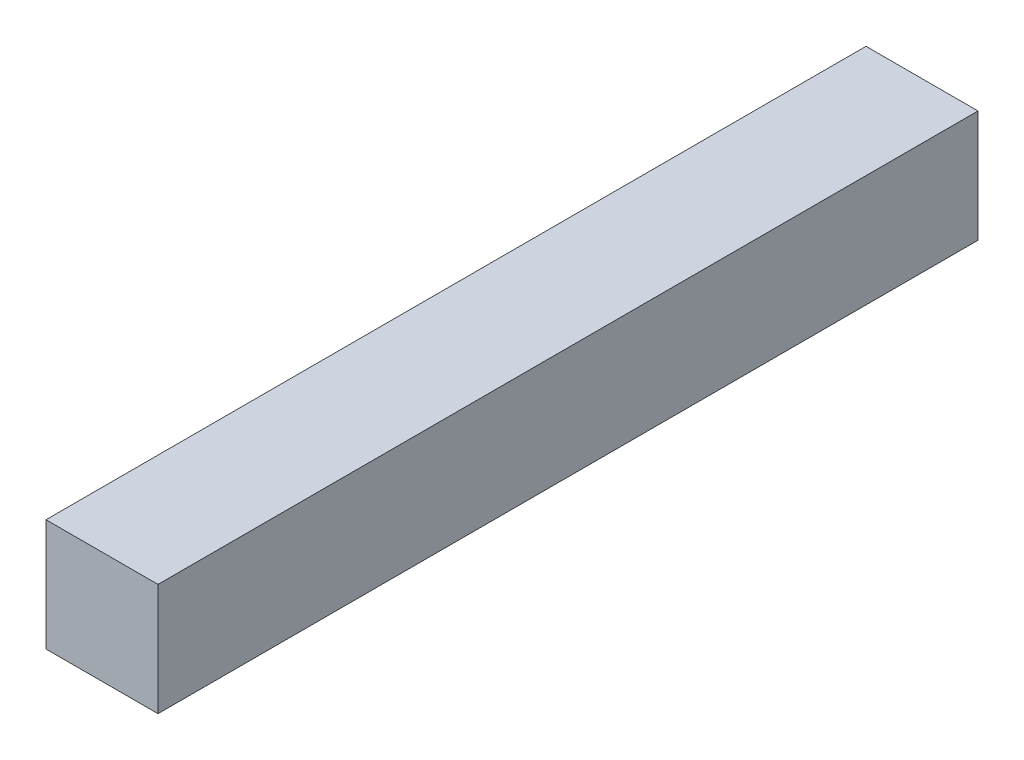
ISO-10303-21;
HEADER;
FILE_DESCRIPTION(('STEP AP214'),'2;1');
FILE_NAME('part.step','',(''),(''),'','','');
FILE_SCHEMA(('AUTOMOTIVE_DESIGN { 1 0 10303 214 1 1 1 1 }'));
ENDSEC;
DATA;
#1=APPLICATION_CONTEXT('core data for automotive mechanical design processes');
#2=APPLICATION_PROTOCOL_DEFINITION('international standard','automotive_design',2000,#1);
#3=PRODUCT_CONTEXT('',#1,'mechanical');
#4=PRODUCT('Part','Part','',(#3));
#5=PRODUCT_RELATED_PRODUCT_CATEGORY('part','',(#4));
#6=PRODUCT_DEFINITION_FORMATION('','',#4);
#7=PRODUCT_DEFINITION_CONTEXT('part definition',#1,'design');
#8=PRODUCT_DEFINITION('design','',#6,#7);
#9=PRODUCT_DEFINITION_SHAPE('','',#8);
#10=(LENGTH_UNIT() NAMED_UNIT(*) SI_UNIT(.MILLI.,.METRE.));
#11=(NAMED_UNIT(*) PLANE_ANGLE_UNIT() SI_UNIT($,.RADIAN.));
#12=(NAMED_UNIT(*) SI_UNIT($,.STERADIAN.) SOLID_ANGLE_UNIT());
#13=UNCERTAINTY_MEASURE_WITH_UNIT(LENGTH_MEASURE(1.E-05),#10,'distance_accuracy_value','');
#14=(GEOMETRIC_REPRESENTATION_CONTEXT(3) GLOBAL_UNCERTAINTY_ASSIGNED_CONTEXT((#13)) GLOBAL_UNIT_ASSIGNED_CONTEXT((#10,
#11,#12)) REPRESENTATION_CONTEXT('',''));
#15=CARTESIAN_POINT('',(0.,0.,0.));
#16=DIRECTION('',(0.,0.,1.));
#17=DIRECTION('',(1.,0.,0.));
#18=AXIS2_PLACEMENT_3D('',#15,#16,#17);
#19=CARTESIAN_POINT('',(-2.39,2.39,35.));
#20=DIRECTION('',(1.,0.,0.));
#21=DIRECTION('',(0.,1.,0.));
#22=AXIS2_PLACEMENT_3D('',#19,#20,#21);
#23=PLANE('',#22);
#24=DIRECTION('',(0.,-1.,0.));
#25=VECTOR('',#24,1.);
#26=CARTESIAN_POINT('',(-2.39,2.39,0.));
#27=LINE('',#26,#25);
#28=CARTESIAN_POINT('',(-2.39,2.39,0.));
#29=VERTEX_POINT('',#28);
#30=CARTESIAN_POINT('',(-2.39,-2.39,0.));
#31=VERTEX_POINT('',#30);
#32=EDGE_CURVE('E96',#29,#31,#27,.T.);
#33=ORIENTED_EDGE('',*,*,#32,.T.);
#34=DIRECTION('',(0.,0.,-1.));
#35=VECTOR('',#34,1.);
#36=CARTESIAN_POINT('',(-2.39,-2.39,35.));
#37=LINE('',#36,#35);
#38=CARTESIAN_POINT('',(-2.39,-2.39,35.));
#39=VERTEX_POINT('',#38);
#40=EDGE_CURVE('E11',#39,#31,#37,.T.);
#41=ORIENTED_EDGE('',*,*,#40,.F.);
#42=DIRECTION('',(0.,-1.,0.));
#43=VECTOR('',#42,1.);
#44=CARTESIAN_POINT('',(-2.39,2.39,35.));
#45=LINE('',#44,#43);
#46=CARTESIAN_POINT('',(-2.39,2.39,35.));
#47=VERTEX_POINT('',#46);
#48=EDGE_CURVE('E82',#47,#39,#45,.T.);
#49=ORIENTED_EDGE('',*,*,#48,.F.);
#50=DIRECTION('',(0.,0.,-1.));
#51=VECTOR('',#50,1.);
#52=CARTESIAN_POINT('',(-2.39,2.39,35.));
#53=LINE('',#52,#51);
#54=EDGE_CURVE('E49',#47,#29,#53,.T.);
#55=ORIENTED_EDGE('',*,*,#54,.T.);
#56=EDGE_LOOP('',(#33,#41,#49,#55));
#57=FACE_BOUND('',#56,.T.);
#58=ADVANCED_FACE('F33',(#57),#23,.F.);
#59=CARTESIAN_POINT('',(-2.39,-2.39,35.));
#60=DIRECTION('',(0.,1.,0.));
#61=DIRECTION('',(0.,0.,1.));
#62=AXIS2_PLACEMENT_3D('',#59,#60,#61);
#63=PLANE('',#62);
#64=DIRECTION('',(1.,0.,0.));
#65=VECTOR('',#64,1.);
#66=CARTESIAN_POINT('',(-2.39,-2.39,0.));
#67=LINE('',#66,#65);
#68=CARTESIAN_POINT('',(2.39,-2.39,0.));
#69=VERTEX_POINT('',#68);
#70=EDGE_CURVE('E87',#31,#69,#67,.T.);
#71=ORIENTED_EDGE('',*,*,#70,.T.);
#72=DIRECTION('',(0.,0.,-1.));
#73=VECTOR('',#72,1.);
#74=CARTESIAN_POINT('',(2.39,-2.39,35.));
#75=LINE('',#74,#73);
#76=CARTESIAN_POINT('',(2.39,-2.39,35.));
#77=VERTEX_POINT('',#76);
#78=EDGE_CURVE('E41',#77,#69,#75,.T.);
#79=ORIENTED_EDGE('',*,*,#78,.F.);
#80=DIRECTION('',(1.,0.,0.));
#81=VECTOR('',#80,1.);
#82=CARTESIAN_POINT('',(-2.39,-2.39,35.));
#83=LINE('',#82,#81);
#84=EDGE_CURVE('E74',#39,#77,#83,.T.);
#85=ORIENTED_EDGE('',*,*,#84,.F.);
#86=ORIENTED_EDGE('',*,*,#40,.T.);
#87=EDGE_LOOP('',(#71,#79,#85,#86));
#88=FACE_BOUND('',#87,.T.);
#89=ADVANCED_FACE('F86',(#88),#63,.F.);
#90=CARTESIAN_POINT('',(2.39,2.39,35.));
#91=DIRECTION('',(1.,0.,0.));
#92=DIRECTION('',(0.,1.,0.));
#93=AXIS2_PLACEMENT_3D('',#90,#91,#92);
#94=PLANE('',#93);
#95=DIRECTION('',(0.,-1.,0.));
#96=VECTOR('',#95,1.);
#97=CARTESIAN_POINT('',(2.39,2.39,0.));
#98=LINE('',#97,#96);
#99=CARTESIAN_POINT('',(2.39,2.39,0.));
#100=VERTEX_POINT('',#99);
#101=EDGE_CURVE('E99',#100,#69,#98,.T.);
#102=ORIENTED_EDGE('',*,*,#101,.F.);
#103=DIRECTION('',(0.,0.,-1.));
#104=VECTOR('',#103,1.);
#105=CARTESIAN_POINT('',(2.39,2.39,35.));
#106=LINE('',#105,#104);
#107=CARTESIAN_POINT('',(2.39,2.39,35.));
#108=VERTEX_POINT('',#107);
#109=EDGE_CURVE('E63',#108,#100,#106,.T.);
#110=ORIENTED_EDGE('',*,*,#109,.F.);
#111=DIRECTION('',(0.,-1.,0.));
#112=VECTOR('',#111,1.);
#113=CARTESIAN_POINT('',(2.39,2.39,35.));
#114=LINE('',#113,#112);
#115=EDGE_CURVE('E81',#108,#77,#114,.T.);
#116=ORIENTED_EDGE('',*,*,#115,.T.);
#117=ORIENTED_EDGE('',*,*,#78,.T.);
#118=EDGE_LOOP('',(#102,#110,#116,#117));
#119=FACE_BOUND('',#118,.T.);
#120=ADVANCED_FACE('F90',(#119),#94,.T.);
#121=CARTESIAN_POINT('',(-2.39,2.39,35.));
#122=DIRECTION('',(0.,1.,0.));
#123=DIRECTION('',(0.,0.,1.));
#124=AXIS2_PLACEMENT_3D('',#121,#122,#123);
#125=PLANE('',#124);
#126=DIRECTION('',(1.,0.,0.));
#127=VECTOR('',#126,1.);
#128=CARTESIAN_POINT('',(-2.39,2.39,0.));
#129=LINE('',#128,#127);
#130=EDGE_CURVE('E101',#29,#100,#129,.T.);
#131=ORIENTED_EDGE('',*,*,#130,.F.);
#132=ORIENTED_EDGE('',*,*,#54,.F.);
#133=DIRECTION('',(1.,0.,0.));
#134=VECTOR('',#133,1.);
#135=CARTESIAN_POINT('',(-2.39,2.39,35.));
#136=LINE('',#135,#134);
#137=EDGE_CURVE('E91',#47,#108,#136,.T.);
#138=ORIENTED_EDGE('',*,*,#137,.T.);
#139=ORIENTED_EDGE('',*,*,#109,.T.);
#140=EDGE_LOOP('',(#131,#132,#138,#139));
#141=FACE_BOUND('',#140,.T.);
#142=ADVANCED_FACE('F107',(#141),#125,.T.);
#143=CARTESIAN_POINT('',(0.,0.,35.));
#144=DIRECTION('',(0.,0.,1.));
#145=DIRECTION('',(1.,0.,0.));
#146=AXIS2_PLACEMENT_3D('',#143,#144,#145);
#147=PLANE('',#146);
#148=ORIENTED_EDGE('',*,*,#48,.T.);
#149=ORIENTED_EDGE('',*,*,#84,.T.);
#150=ORIENTED_EDGE('',*,*,#115,.F.);
#151=ORIENTED_EDGE('',*,*,#137,.F.);
#152=EDGE_LOOP('',(#148,#149,#150,#151));
#153=FACE_BOUND('',#152,.T.);
#154=ADVANCED_FACE('F78',(#153),#147,.T.);
#155=CARTESIAN_POINT('',(0.,0.,0.));
#156=DIRECTION('',(0.,0.,1.));
#157=DIRECTION('',(1.,0.,0.));
#158=AXIS2_PLACEMENT_3D('',#155,#156,#157);
#159=PLANE('',#158);
#160=ORIENTED_EDGE('',*,*,#32,.F.);
#161=ORIENTED_EDGE('',*,*,#130,.T.);
#162=ORIENTED_EDGE('',*,*,#101,.T.);
#163=ORIENTED_EDGE('',*,*,#70,.F.);
#164=EDGE_LOOP('',(#160,#161,#162,#163));
#165=FACE_BOUND('',#164,.T.);
#166=ADVANCED_FACE('F106',(#165),#159,.F.);
#167=CLOSED_SHELL('',(#58,#89,#120,#142,#154,#166));
#168=MANIFOLD_SOLID_BREP('B2',#167);
#169=ADVANCED_BREP_SHAPE_REPRESENTATION('',(#18,#168),#14);
#170=SHAPE_DEFINITION_REPRESENTATION(#9,#169);
ENDSEC;
END-ISO-10303-21;
